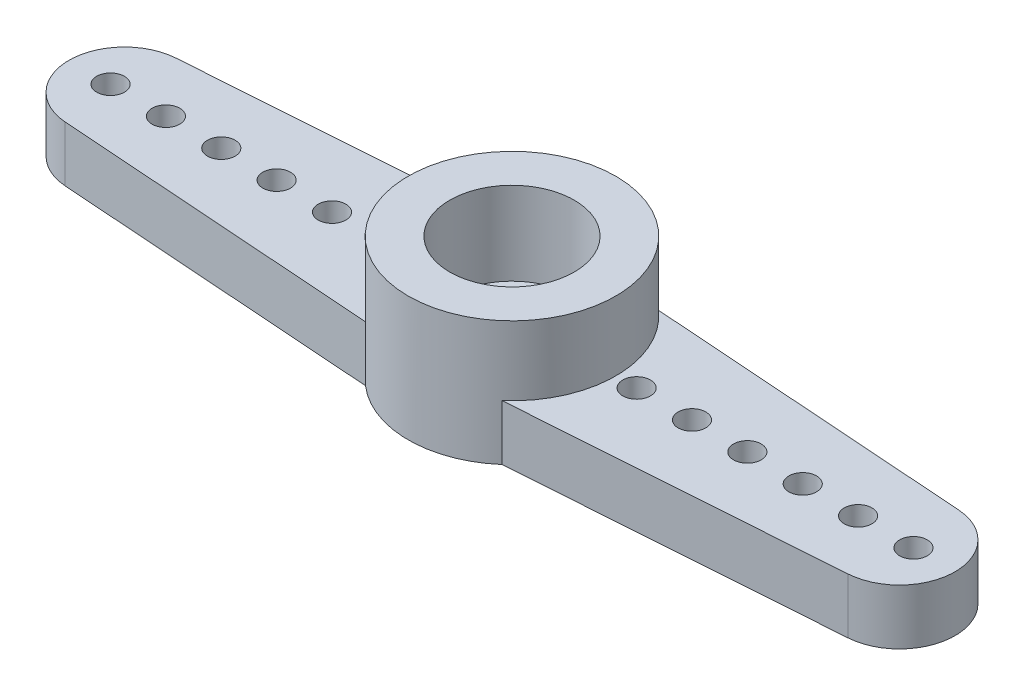
ISO-10303-21;
HEADER;
FILE_DESCRIPTION(('STEP AP214'),'2;1');
FILE_NAME('part.step','',(''),(''),'','','');
FILE_SCHEMA(('AUTOMOTIVE_DESIGN { 1 0 10303 214 1 1 1 1 }'));
ENDSEC;
DATA;
#1=APPLICATION_CONTEXT('core data for automotive mechanical design processes');
#2=APPLICATION_PROTOCOL_DEFINITION('international standard','automotive_design',2000,#1);
#3=PRODUCT_CONTEXT('',#1,'mechanical');
#4=PRODUCT('Part','Part','',(#3));
#5=PRODUCT_RELATED_PRODUCT_CATEGORY('part','',(#4));
#6=PRODUCT_DEFINITION_FORMATION('','',#4);
#7=PRODUCT_DEFINITION_CONTEXT('part definition',#1,'design');
#8=PRODUCT_DEFINITION('design','',#6,#7);
#9=PRODUCT_DEFINITION_SHAPE('','',#8);
#10=(LENGTH_UNIT() NAMED_UNIT(*) SI_UNIT(.MILLI.,.METRE.));
#11=(NAMED_UNIT(*) PLANE_ANGLE_UNIT() SI_UNIT($,.RADIAN.));
#12=(NAMED_UNIT(*) SI_UNIT($,.STERADIAN.) SOLID_ANGLE_UNIT());
#13=UNCERTAINTY_MEASURE_WITH_UNIT(LENGTH_MEASURE(1.E-05),#10,'distance_accuracy_value','');
#14=(GEOMETRIC_REPRESENTATION_CONTEXT(3) GLOBAL_UNCERTAINTY_ASSIGNED_CONTEXT((#13)) GLOBAL_UNIT_ASSIGNED_CONTEXT((#10,
#11,#12)) REPRESENTATION_CONTEXT('',''));
#15=CARTESIAN_POINT('',(0.,0.,0.));
#16=DIRECTION('',(0.,0.,1.));
#17=DIRECTION('',(1.,0.,0.));
#18=AXIS2_PLACEMENT_3D('',#15,#16,#17);
#19=CARTESIAN_POINT('',(0.,2.,-3.));
#20=DIRECTION('',(-0.070562639205869,0.,0.997507350322945));
#21=DIRECTION('',(0.997507350322945,0.,0.0705626392058691));
#22=AXIS2_PLACEMENT_3D('',#19,#20,#21);
#23=PLANE('',#22);
#24=DIRECTION('',(0.,-1.,0.));
#25=VECTOR('',#24,1.);
#26=CARTESIAN_POINT('',(2.46546325686744,4.5,-2.82559567685056));
#27=LINE('',#26,#25);
#28=CARTESIAN_POINT('',(2.46546325686744,2.,-2.82559567685056));
#29=VERTEX_POINT('',#28);
#30=CARTESIAN_POINT('',(2.46546325686744,0.,-2.82559567685056));
#31=VERTEX_POINT('',#30);
#32=EDGE_CURVE('E48',#29,#31,#27,.T.);
#33=ORIENTED_EDGE('',*,*,#32,.F.);
#34=DIRECTION('',(-0.997507350322945,0.,-0.0705626392058691));
#35=VECTOR('',#34,1.);
#36=CARTESIAN_POINT('',(0.,2.,-3.));
#37=LINE('',#36,#35);
#38=CARTESIAN_POINT('',(14.1364801763251,2.,-2.));
#39=VERTEX_POINT('',#38);
#40=EDGE_CURVE('E181',#39,#29,#37,.T.);
#41=ORIENTED_EDGE('',*,*,#40,.F.);
#42=DIRECTION('',(0.,-1.,0.));
#43=VECTOR('',#42,1.);
#44=CARTESIAN_POINT('',(14.1364801763251,2.,-2.));
#45=LINE('',#44,#43);
#46=CARTESIAN_POINT('',(14.1364801763251,0.,-2.));
#47=VERTEX_POINT('',#46);
#48=EDGE_CURVE('E41',#39,#47,#45,.T.);
#49=ORIENTED_EDGE('',*,*,#48,.T.);
#50=DIRECTION('',(-0.997507350322945,0.,-0.0705626392058691));
#51=VECTOR('',#50,1.);
#52=CARTESIAN_POINT('',(0.,0.,-3.));
#53=LINE('',#52,#51);
#54=EDGE_CURVE('E53',#47,#31,#53,.T.);
#55=ORIENTED_EDGE('',*,*,#54,.T.);
#56=EDGE_LOOP('',(#33,#41,#49,#55));
#57=FACE_BOUND('',#56,.T.);
#58=ADVANCED_FACE('F33',(#57),#23,.F.);
#59=CARTESIAN_POINT('',(13.9950022429885,2.,0.));
#60=DIRECTION('',(0.,-1.,0.));
#61=DIRECTION('',(0.,0.,-1.));
#62=AXIS2_PLACEMENT_3D('',#59,#60,#61);
#63=PLANE('',#62);
#64=CARTESIAN_POINT('',(0.,2.,0.));
#65=DIRECTION('',(0.,-1.,0.));
#66=DIRECTION('',(0.,0.,-1.));
#67=AXIS2_PLACEMENT_3D('',#64,#65,#66);
#68=CIRCLE('',#67,3.75);
#69=CARTESIAN_POINT('',(-2.46546325686744,2.,-2.82559567685056));
#70=VERTEX_POINT('',#69);
#71=CARTESIAN_POINT('',(-2.46546325686744,2.,2.82559567685056));
#72=VERTEX_POINT('',#71);
#73=EDGE_CURVE('E199',#70,#72,#68,.F.);
#74=ORIENTED_EDGE('',*,*,#73,.F.);
#75=DIRECTION('',(0.997507350322945,0.,-0.0705626392058691));
#76=VECTOR('',#75,1.);
#77=CARTESIAN_POINT('',(0.,2.,-3.));
#78=LINE('',#77,#76);
#79=CARTESIAN_POINT('',(-14.1364801763251,2.,-2.));
#80=VERTEX_POINT('',#79);
#81=EDGE_CURVE('E107',#80,#70,#78,.T.);
#82=ORIENTED_EDGE('',*,*,#81,.F.);
#83=CARTESIAN_POINT('',(-13.9950022429885,2.,0.));
#84=DIRECTION('',(0.,-1.,0.));
#85=DIRECTION('',(0.,0.,-1.));
#86=AXIS2_PLACEMENT_3D('',#83,#84,#85);
#87=CIRCLE('',#86,2.00499775701151);
#88=CARTESIAN_POINT('',(-14.1364801763251,2.,2.));
#89=VERTEX_POINT('',#88);
#90=EDGE_CURVE('E99',#89,#80,#87,.T.);
#91=ORIENTED_EDGE('',*,*,#90,.F.);
#92=DIRECTION('',(0.997507350322945,0.,0.0705626392058691));
#93=VECTOR('',#92,1.);
#94=CARTESIAN_POINT('',(0.,2.,3.));
#95=LINE('',#94,#93);
#96=EDGE_CURVE('E104',#89,#72,#95,.T.);
#97=ORIENTED_EDGE('',*,*,#96,.T.);
#98=EDGE_LOOP('',(#74,#82,#91,#97));
#99=FACE_BOUND('',#98,.T.);
#100=CARTESIAN_POINT('',(-4.5,2.,0.));
#101=DIRECTION('',(0.,-1.,0.));
#102=DIRECTION('',(0.,0.,-1.));
#103=AXIS2_PLACEMENT_3D('',#100,#101,#102);
#104=CIRCLE('',#103,0.500000000000001);
#105=CARTESIAN_POINT('',(-4.5,2.,-0.500000000000001));
#106=VERTEX_POINT('',#105);
#107=EDGE_CURVE('E123',#106,#106,#104,.T.);
#108=ORIENTED_EDGE('',*,*,#107,.T.);
#109=EDGE_LOOP('',(#108));
#110=FACE_BOUND('',#109,.T.);
#111=CARTESIAN_POINT('',(-6.5,2.,0.));
#112=DIRECTION('',(0.,-1.,0.));
#113=DIRECTION('',(0.,0.,-1.));
#114=AXIS2_PLACEMENT_3D('',#111,#112,#113);
#115=CIRCLE('',#114,0.500000000000001);
#116=CARTESIAN_POINT('',(-6.5,2.,-0.500000000000001));
#117=VERTEX_POINT('',#116);
#118=EDGE_CURVE('E239',#117,#117,#115,.T.);
#119=ORIENTED_EDGE('',*,*,#118,.T.);
#120=EDGE_LOOP('',(#119));
#121=FACE_BOUND('',#120,.T.);
#122=CARTESIAN_POINT('',(-8.5,2.,0.));
#123=DIRECTION('',(0.,-1.,0.));
#124=DIRECTION('',(0.,0.,-1.));
#125=AXIS2_PLACEMENT_3D('',#122,#123,#124);
#126=CIRCLE('',#125,0.500000000000001);
#127=CARTESIAN_POINT('',(-8.5,2.,-0.500000000000001));
#128=VERTEX_POINT('',#127);
#129=EDGE_CURVE('E233',#128,#128,#126,.T.);
#130=ORIENTED_EDGE('',*,*,#129,.T.);
#131=EDGE_LOOP('',(#130));
#132=FACE_BOUND('',#131,.T.);
#133=CARTESIAN_POINT('',(-10.5,2.,0.));
#134=DIRECTION('',(0.,-1.,0.));
#135=DIRECTION('',(0.,0.,-1.));
#136=AXIS2_PLACEMENT_3D('',#133,#134,#135);
#137=CIRCLE('',#136,0.500000000000001);
#138=CARTESIAN_POINT('',(-10.5,2.,-0.500000000000001));
#139=VERTEX_POINT('',#138);
#140=EDGE_CURVE('E227',#139,#139,#137,.T.);
#141=ORIENTED_EDGE('',*,*,#140,.T.);
#142=EDGE_LOOP('',(#141));
#143=FACE_BOUND('',#142,.T.);
#144=CARTESIAN_POINT('',(-12.5,2.,0.));
#145=DIRECTION('',(0.,-1.,0.));
#146=DIRECTION('',(0.,0.,-1.));
#147=AXIS2_PLACEMENT_3D('',#144,#145,#146);
#148=CIRCLE('',#147,0.500000000000001);
#149=CARTESIAN_POINT('',(-12.5,2.,-0.500000000000001));
#150=VERTEX_POINT('',#149);
#151=EDGE_CURVE('E221',#150,#150,#148,.T.);
#152=ORIENTED_EDGE('',*,*,#151,.T.);
#153=EDGE_LOOP('',(#152));
#154=FACE_BOUND('',#153,.T.);
#155=CARTESIAN_POINT('',(-14.5,2.,0.));
#156=DIRECTION('',(0.,-1.,0.));
#157=DIRECTION('',(0.,0.,-1.));
#158=AXIS2_PLACEMENT_3D('',#155,#156,#157);
#159=CIRCLE('',#158,0.500000000000001);
#160=CARTESIAN_POINT('',(-14.5,2.,-0.500000000000001));
#161=VERTEX_POINT('',#160);
#162=EDGE_CURVE('E215',#161,#161,#159,.T.);
#163=ORIENTED_EDGE('',*,*,#162,.T.);
#164=EDGE_LOOP('',(#163));
#165=FACE_BOUND('',#164,.T.);
#166=ADVANCED_FACE('F101',(#99,#110,#121,#132,#143,#154,#165),#63,.F.);
#167=CARTESIAN_POINT('',(0.,2.,3.));
#168=DIRECTION('',(0.070562639205869,0.,0.997507350322945));
#169=DIRECTION('',(0.997507350322945,0.,-0.0705626392058691));
#170=AXIS2_PLACEMENT_3D('',#167,#168,#169);
#171=PLANE('',#170);
#172=DIRECTION('',(-0.997507350322945,0.,0.0705626392058691));
#173=VECTOR('',#172,1.);
#174=CARTESIAN_POINT('',(0.,2.,3.));
#175=LINE('',#174,#173);
#176=CARTESIAN_POINT('',(14.1364801763251,2.,2.));
#177=VERTEX_POINT('',#176);
#178=CARTESIAN_POINT('',(2.46546325686744,2.,2.82559567685056));
#179=VERTEX_POINT('',#178);
#180=EDGE_CURVE('E170',#177,#179,#175,.T.);
#181=ORIENTED_EDGE('',*,*,#180,.T.);
#182=DIRECTION('',(0.,-1.,0.));
#183=VECTOR('',#182,1.);
#184=CARTESIAN_POINT('',(2.46546325686744,4.5,2.82559567685056));
#185=LINE('',#184,#183);
#186=CARTESIAN_POINT('',(2.46546325686744,0.,2.82559567685056));
#187=VERTEX_POINT('',#186);
#188=EDGE_CURVE('E209',#179,#187,#185,.T.);
#189=ORIENTED_EDGE('',*,*,#188,.T.);
#190=DIRECTION('',(-0.997507350322945,0.,0.0705626392058691));
#191=VECTOR('',#190,1.);
#192=CARTESIAN_POINT('',(0.,0.,3.));
#193=LINE('',#192,#191);
#194=CARTESIAN_POINT('',(14.1364801763251,0.,2.));
#195=VERTEX_POINT('',#194);
#196=EDGE_CURVE('E169',#195,#187,#193,.T.);
#197=ORIENTED_EDGE('',*,*,#196,.F.);
#198=DIRECTION('',(0.,-1.,0.));
#199=VECTOR('',#198,1.);
#200=CARTESIAN_POINT('',(14.1364801763251,2.,2.));
#201=LINE('',#200,#199);
#202=EDGE_CURVE('E173',#177,#195,#201,.T.);
#203=ORIENTED_EDGE('',*,*,#202,.F.);
#204=EDGE_LOOP('',(#181,#189,#197,#203));
#205=FACE_BOUND('',#204,.T.);
#206=ADVANCED_FACE('F267',(#205),#171,.T.);
#207=CARTESIAN_POINT('',(0.,2.,-3.));
#208=DIRECTION('',(-0.070562639205869,0.,-0.997507350322945));
#209=DIRECTION('',(-0.997507350322945,0.,0.0705626392058691));
#210=AXIS2_PLACEMENT_3D('',#207,#208,#209);
#211=PLANE('',#210);
#212=ORIENTED_EDGE('',*,*,#81,.T.);
#213=DIRECTION('',(0.,-1.,0.));
#214=VECTOR('',#213,1.);
#215=CARTESIAN_POINT('',(-2.46546325686744,4.5,-2.82559567685056));
#216=LINE('',#215,#214);
#217=CARTESIAN_POINT('',(-2.46546325686744,0.,-2.82559567685056));
#218=VERTEX_POINT('',#217);
#219=EDGE_CURVE('E206',#70,#218,#216,.T.);
#220=ORIENTED_EDGE('',*,*,#219,.T.);
#221=DIRECTION('',(0.997507350322945,0.,-0.0705626392058691));
#222=VECTOR('',#221,1.);
#223=CARTESIAN_POINT('',(0.,0.,-3.));
#224=LINE('',#223,#222);
#225=CARTESIAN_POINT('',(-14.1364801763251,0.,-2.));
#226=VERTEX_POINT('',#225);
#227=EDGE_CURVE('E118',#226,#218,#224,.T.);
#228=ORIENTED_EDGE('',*,*,#227,.F.);
#229=DIRECTION('',(0.,-1.,0.));
#230=VECTOR('',#229,1.);
#231=CARTESIAN_POINT('',(-14.1364801763251,2.,-2.));
#232=LINE('',#231,#230);
#233=EDGE_CURVE('E109',#80,#226,#232,.T.);
#234=ORIENTED_EDGE('',*,*,#233,.F.);
#235=EDGE_LOOP('',(#212,#220,#228,#234));
#236=FACE_BOUND('',#235,.T.);
#237=ADVANCED_FACE('F279',(#236),#211,.T.);
#238=CARTESIAN_POINT('',(0.,2.,3.));
#239=DIRECTION('',(0.070562639205869,0.,-0.997507350322945));
#240=DIRECTION('',(-0.997507350322945,0.,-0.0705626392058691));
#241=AXIS2_PLACEMENT_3D('',#238,#239,#240);
#242=PLANE('',#241);
#243=DIRECTION('',(0.,-1.,0.));
#244=VECTOR('',#243,1.);
#245=CARTESIAN_POINT('',(-2.46546325686744,4.5,2.82559567685056));
#246=LINE('',#245,#244);
#247=CARTESIAN_POINT('',(-2.46546325686744,0.,2.82559567685056));
#248=VERTEX_POINT('',#247);
#249=EDGE_CURVE('E11',#72,#248,#246,.T.);
#250=ORIENTED_EDGE('',*,*,#249,.F.);
#251=ORIENTED_EDGE('',*,*,#96,.F.);
#252=DIRECTION('',(0.,-1.,0.));
#253=VECTOR('',#252,1.);
#254=CARTESIAN_POINT('',(-14.1364801763251,2.,2.));
#255=LINE('',#254,#253);
#256=CARTESIAN_POINT('',(-14.1364801763251,0.,2.));
#257=VERTEX_POINT('',#256);
#258=EDGE_CURVE('E112',#89,#257,#255,.T.);
#259=ORIENTED_EDGE('',*,*,#258,.T.);
#260=DIRECTION('',(0.997507350322945,0.,0.0705626392058691));
#261=VECTOR('',#260,1.);
#262=CARTESIAN_POINT('',(0.,0.,3.));
#263=LINE('',#262,#261);
#264=EDGE_CURVE('E121',#257,#248,#263,.T.);
#265=ORIENTED_EDGE('',*,*,#264,.T.);
#266=EDGE_LOOP('',(#250,#251,#259,#265));
#267=FACE_BOUND('',#266,.T.);
#268=ADVANCED_FACE('F120',(#267),#242,.F.);
#269=CARTESIAN_POINT('',(13.9950022429885,2.,0.));
#270=DIRECTION('',(0.,-1.,0.));
#271=DIRECTION('',(0.,0.,-1.));
#272=AXIS2_PLACEMENT_3D('',#269,#270,#271);
#273=CYLINDRICAL_SURFACE('',#272,2.00499775701151);
#274=CARTESIAN_POINT('',(13.9950022429885,0.,0.));
#275=DIRECTION('',(0.,1.,0.));
#276=DIRECTION('',(0.,0.,-1.));
#277=AXIS2_PLACEMENT_3D('',#274,#275,#276);
#278=CIRCLE('',#277,2.00499775701151);
#279=EDGE_CURVE('E178',#195,#47,#278,.T.);
#280=ORIENTED_EDGE('',*,*,#279,.T.);
#281=ORIENTED_EDGE('',*,*,#48,.F.);
#282=CARTESIAN_POINT('',(13.9950022429885,2.,0.));
#283=DIRECTION('',(0.,1.,0.));
#284=DIRECTION('',(0.,0.,-1.));
#285=AXIS2_PLACEMENT_3D('',#282,#283,#284);
#286=CIRCLE('',#285,2.00499775701151);
#287=EDGE_CURVE('E179',#177,#39,#286,.T.);
#288=ORIENTED_EDGE('',*,*,#287,.F.);
#289=ORIENTED_EDGE('',*,*,#202,.T.);
#290=EDGE_LOOP('',(#280,#281,#288,#289));
#291=FACE_BOUND('',#290,.T.);
#292=ADVANCED_FACE('F35',(#291),#273,.T.);
#293=EDGE_CURVE('E207',#179,#29,#68,.F.);
#294=ORIENTED_EDGE('',*,*,#293,.F.);
#295=ORIENTED_EDGE('',*,*,#180,.F.);
#296=ORIENTED_EDGE('',*,*,#287,.T.);
#297=ORIENTED_EDGE('',*,*,#40,.T.);
#298=EDGE_LOOP('',(#294,#295,#296,#297));
#299=FACE_BOUND('',#298,.T.);
#300=CARTESIAN_POINT('',(14.5,2.,0.));
#301=DIRECTION('',(0.,-1.,0.));
#302=DIRECTION('',(0.,0.,-1.));
#303=AXIS2_PLACEMENT_3D('',#300,#301,#302);
#304=CIRCLE('',#303,0.500000000000001);
#305=CARTESIAN_POINT('',(14.5,2.,-0.500000000000001));
#306=VERTEX_POINT('',#305);
#307=EDGE_CURVE('E136',#306,#306,#304,.F.);
#308=ORIENTED_EDGE('',*,*,#307,.F.);
#309=EDGE_LOOP('',(#308));
#310=FACE_BOUND('',#309,.T.);
#311=CARTESIAN_POINT('',(12.5,2.,0.));
#312=DIRECTION('',(0.,-1.,0.));
#313=DIRECTION('',(0.,0.,-1.));
#314=AXIS2_PLACEMENT_3D('',#311,#312,#313);
#315=CIRCLE('',#314,0.500000000000001);
#316=CARTESIAN_POINT('',(12.5,2.,-0.500000000000001));
#317=VERTEX_POINT('',#316);
#318=EDGE_CURVE('E142',#317,#317,#315,.F.);
#319=ORIENTED_EDGE('',*,*,#318,.F.);
#320=EDGE_LOOP('',(#319));
#321=FACE_BOUND('',#320,.T.);
#322=CARTESIAN_POINT('',(10.5,2.,0.));
#323=DIRECTION('',(0.,-1.,0.));
#324=DIRECTION('',(0.,0.,-1.));
#325=AXIS2_PLACEMENT_3D('',#322,#323,#324);
#326=CIRCLE('',#325,0.500000000000001);
#327=CARTESIAN_POINT('',(10.5,2.,-0.500000000000001));
#328=VERTEX_POINT('',#327);
#329=EDGE_CURVE('E148',#328,#328,#326,.F.);
#330=ORIENTED_EDGE('',*,*,#329,.F.);
#331=EDGE_LOOP('',(#330));
#332=FACE_BOUND('',#331,.T.);
#333=CARTESIAN_POINT('',(8.5,2.,0.));
#334=DIRECTION('',(0.,-1.,0.));
#335=DIRECTION('',(0.,0.,-1.));
#336=AXIS2_PLACEMENT_3D('',#333,#334,#335);
#337=CIRCLE('',#336,0.500000000000001);
#338=CARTESIAN_POINT('',(8.5,2.,-0.500000000000001));
#339=VERTEX_POINT('',#338);
#340=EDGE_CURVE('E154',#339,#339,#337,.F.);
#341=ORIENTED_EDGE('',*,*,#340,.F.);
#342=EDGE_LOOP('',(#341));
#343=FACE_BOUND('',#342,.T.);
#344=CARTESIAN_POINT('',(6.5,2.,0.));
#345=DIRECTION('',(0.,-1.,0.));
#346=DIRECTION('',(0.,0.,-1.));
#347=AXIS2_PLACEMENT_3D('',#344,#345,#346);
#348=CIRCLE('',#347,0.500000000000001);
#349=CARTESIAN_POINT('',(6.5,2.,-0.500000000000001));
#350=VERTEX_POINT('',#349);
#351=EDGE_CURVE('E160',#350,#350,#348,.F.);
#352=ORIENTED_EDGE('',*,*,#351,.F.);
#353=EDGE_LOOP('',(#352));
#354=FACE_BOUND('',#353,.T.);
#355=CARTESIAN_POINT('',(4.5,2.,0.));
#356=DIRECTION('',(0.,-1.,0.));
#357=DIRECTION('',(0.,0.,-1.));
#358=AXIS2_PLACEMENT_3D('',#355,#356,#357);
#359=CIRCLE('',#358,0.500000000000001);
#360=CARTESIAN_POINT('',(4.5,2.,-0.500000000000001));
#361=VERTEX_POINT('',#360);
#362=EDGE_CURVE('E166',#361,#361,#359,.F.);
#363=ORIENTED_EDGE('',*,*,#362,.F.);
#364=EDGE_LOOP('',(#363));
#365=FACE_BOUND('',#364,.T.);
#366=ADVANCED_FACE('F269',(#299,#310,#321,#332,#343,#354,#365),#63,.F.);
#367=CARTESIAN_POINT('',(13.9950022429885,0.,0.));
#368=DIRECTION('',(0.,-1.,0.));
#369=DIRECTION('',(0.,0.,-1.));
#370=AXIS2_PLACEMENT_3D('',#367,#368,#369);
#371=PLANE('',#370);
#372=CARTESIAN_POINT('',(0.,0.,0.));
#373=DIRECTION('',(0.,-1.,0.));
#374=DIRECTION('',(0.,0.,-1.));
#375=AXIS2_PLACEMENT_3D('',#372,#373,#374);
#376=CIRCLE('',#375,1.4);
#377=CARTESIAN_POINT('',(0.,0.,-1.4));
#378=VERTEX_POINT('',#377);
#379=EDGE_CURVE('E487',#378,#378,#376,.T.);
#380=ORIENTED_EDGE('',*,*,#379,.F.);
#381=EDGE_LOOP('',(#380));
#382=FACE_BOUND('',#381,.T.);
#383=ORIENTED_EDGE('',*,*,#196,.T.);
#384=CARTESIAN_POINT('',(0.,0.,0.));
#385=DIRECTION('',(0.,1.,0.));
#386=DIRECTION('',(0.,0.,1.));
#387=AXIS2_PLACEMENT_3D('',#384,#385,#386);
#388=CIRCLE('',#387,3.75);
#389=EDGE_CURVE('E196',#248,#187,#388,.T.);
#390=ORIENTED_EDGE('',*,*,#389,.F.);
#391=ORIENTED_EDGE('',*,*,#264,.F.);
#392=CARTESIAN_POINT('',(-13.9950022429885,0.,0.));
#393=DIRECTION('',(0.,-1.,0.));
#394=DIRECTION('',(0.,0.,-1.));
#395=AXIS2_PLACEMENT_3D('',#392,#393,#394);
#396=CIRCLE('',#395,2.00499775701151);
#397=EDGE_CURVE('E115',#257,#226,#396,.T.);
#398=ORIENTED_EDGE('',*,*,#397,.T.);
#399=ORIENTED_EDGE('',*,*,#227,.T.);
#400=EDGE_CURVE('E191',#31,#218,#388,.T.);
#401=ORIENTED_EDGE('',*,*,#400,.F.);
#402=ORIENTED_EDGE('',*,*,#54,.F.);
#403=ORIENTED_EDGE('',*,*,#279,.F.);
#404=EDGE_LOOP('',(#383,#390,#391,#398,#399,#401,#402,#403));
#405=FACE_BOUND('',#404,.T.);
#406=CARTESIAN_POINT('',(14.5,0.,0.));
#407=DIRECTION('',(0.,1.,0.));
#408=DIRECTION('',(0.,0.,1.));
#409=AXIS2_PLACEMENT_3D('',#406,#407,#408);
#410=CIRCLE('',#409,0.500000000000001);
#411=CARTESIAN_POINT('',(14.5,0.,0.500000000000001));
#412=VERTEX_POINT('',#411);
#413=EDGE_CURVE('E133',#412,#412,#410,.T.);
#414=ORIENTED_EDGE('',*,*,#413,.T.);
#415=EDGE_LOOP('',(#414));
#416=FACE_BOUND('',#415,.T.);
#417=CARTESIAN_POINT('',(12.5,0.,0.));
#418=DIRECTION('',(0.,1.,0.));
#419=DIRECTION('',(0.,0.,1.));
#420=AXIS2_PLACEMENT_3D('',#417,#418,#419);
#421=CIRCLE('',#420,0.500000000000001);
#422=CARTESIAN_POINT('',(12.5,0.,0.500000000000001));
#423=VERTEX_POINT('',#422);
#424=EDGE_CURVE('E139',#423,#423,#421,.T.);
#425=ORIENTED_EDGE('',*,*,#424,.T.);
#426=EDGE_LOOP('',(#425));
#427=FACE_BOUND('',#426,.T.);
#428=CARTESIAN_POINT('',(10.5,0.,0.));
#429=DIRECTION('',(0.,1.,0.));
#430=DIRECTION('',(0.,0.,1.));
#431=AXIS2_PLACEMENT_3D('',#428,#429,#430);
#432=CIRCLE('',#431,0.500000000000001);
#433=CARTESIAN_POINT('',(10.5,0.,0.500000000000001));
#434=VERTEX_POINT('',#433);
#435=EDGE_CURVE('E145',#434,#434,#432,.T.);
#436=ORIENTED_EDGE('',*,*,#435,.T.);
#437=EDGE_LOOP('',(#436));
#438=FACE_BOUND('',#437,.T.);
#439=CARTESIAN_POINT('',(8.5,0.,0.));
#440=DIRECTION('',(0.,1.,0.));
#441=DIRECTION('',(0.,0.,1.));
#442=AXIS2_PLACEMENT_3D('',#439,#440,#441);
#443=CIRCLE('',#442,0.500000000000001);
#444=CARTESIAN_POINT('',(8.5,0.,0.500000000000001));
#445=VERTEX_POINT('',#444);
#446=EDGE_CURVE('E151',#445,#445,#443,.T.);
#447=ORIENTED_EDGE('',*,*,#446,.T.);
#448=EDGE_LOOP('',(#447));
#449=FACE_BOUND('',#448,.T.);
#450=CARTESIAN_POINT('',(6.5,0.,0.));
#451=DIRECTION('',(0.,1.,0.));
#452=DIRECTION('',(0.,0.,1.));
#453=AXIS2_PLACEMENT_3D('',#450,#451,#452);
#454=CIRCLE('',#453,0.500000000000001);
#455=CARTESIAN_POINT('',(6.5,0.,0.500000000000001));
#456=VERTEX_POINT('',#455);
#457=EDGE_CURVE('E157',#456,#456,#454,.T.);
#458=ORIENTED_EDGE('',*,*,#457,.T.);
#459=EDGE_LOOP('',(#458));
#460=FACE_BOUND('',#459,.T.);
#461=CARTESIAN_POINT('',(4.5,0.,0.));
#462=DIRECTION('',(0.,1.,0.));
#463=DIRECTION('',(0.,0.,1.));
#464=AXIS2_PLACEMENT_3D('',#461,#462,#463);
#465=CIRCLE('',#464,0.500000000000001);
#466=CARTESIAN_POINT('',(4.5,0.,0.500000000000001));
#467=VERTEX_POINT('',#466);
#468=EDGE_CURVE('E163',#467,#467,#465,.T.);
#469=ORIENTED_EDGE('',*,*,#468,.T.);
#470=EDGE_LOOP('',(#469));
#471=FACE_BOUND('',#470,.T.);
#472=CARTESIAN_POINT('',(-4.5,0.,0.));
#473=DIRECTION('',(0.,-1.,0.));
#474=DIRECTION('',(0.,0.,1.));
#475=AXIS2_PLACEMENT_3D('',#472,#473,#474);
#476=CIRCLE('',#475,0.500000000000001);
#477=CARTESIAN_POINT('',(-4.5,0.,0.500000000000001));
#478=VERTEX_POINT('',#477);
#479=EDGE_CURVE('E241',#478,#478,#476,.T.);
#480=ORIENTED_EDGE('',*,*,#479,.F.);
#481=EDGE_LOOP('',(#480));
#482=FACE_BOUND('',#481,.T.);
#483=CARTESIAN_POINT('',(-6.5,0.,0.));
#484=DIRECTION('',(0.,-1.,0.));
#485=DIRECTION('',(0.,0.,1.));
#486=AXIS2_PLACEMENT_3D('',#483,#484,#485);
#487=CIRCLE('',#486,0.500000000000001);
#488=CARTESIAN_POINT('',(-6.5,0.,0.500000000000001));
#489=VERTEX_POINT('',#488);
#490=EDGE_CURVE('E236',#489,#489,#487,.T.);
#491=ORIENTED_EDGE('',*,*,#490,.F.);
#492=EDGE_LOOP('',(#491));
#493=FACE_BOUND('',#492,.T.);
#494=CARTESIAN_POINT('',(-8.5,0.,0.));
#495=DIRECTION('',(0.,-1.,0.));
#496=DIRECTION('',(0.,0.,1.));
#497=AXIS2_PLACEMENT_3D('',#494,#495,#496);
#498=CIRCLE('',#497,0.500000000000001);
#499=CARTESIAN_POINT('',(-8.5,0.,0.500000000000001));
#500=VERTEX_POINT('',#499);
#501=EDGE_CURVE('E230',#500,#500,#498,.T.);
#502=ORIENTED_EDGE('',*,*,#501,.F.);
#503=EDGE_LOOP('',(#502));
#504=FACE_BOUND('',#503,.T.);
#505=CARTESIAN_POINT('',(-10.5,0.,0.));
#506=DIRECTION('',(0.,-1.,0.));
#507=DIRECTION('',(0.,0.,1.));
#508=AXIS2_PLACEMENT_3D('',#505,#506,#507);
#509=CIRCLE('',#508,0.500000000000001);
#510=CARTESIAN_POINT('',(-10.5,0.,0.500000000000001));
#511=VERTEX_POINT('',#510);
#512=EDGE_CURVE('E224',#511,#511,#509,.T.);
#513=ORIENTED_EDGE('',*,*,#512,.F.);
#514=EDGE_LOOP('',(#513));
#515=FACE_BOUND('',#514,.T.);
#516=CARTESIAN_POINT('',(-12.5,0.,0.));
#517=DIRECTION('',(0.,-1.,0.));
#518=DIRECTION('',(0.,0.,1.));
#519=AXIS2_PLACEMENT_3D('',#516,#517,#518);
#520=CIRCLE('',#519,0.500000000000001);
#521=CARTESIAN_POINT('',(-12.5,0.,0.500000000000001));
#522=VERTEX_POINT('',#521);
#523=EDGE_CURVE('E218',#522,#522,#520,.T.);
#524=ORIENTED_EDGE('',*,*,#523,.F.);
#525=EDGE_LOOP('',(#524));
#526=FACE_BOUND('',#525,.T.);
#527=CARTESIAN_POINT('',(-14.5,0.,0.));
#528=DIRECTION('',(0.,-1.,0.));
#529=DIRECTION('',(0.,0.,1.));
#530=AXIS2_PLACEMENT_3D('',#527,#528,#529);
#531=CIRCLE('',#530,0.500000000000001);
#532=CARTESIAN_POINT('',(-14.5,0.,0.500000000000001));
#533=VERTEX_POINT('',#532);
#534=EDGE_CURVE('E212',#533,#533,#531,.T.);
#535=ORIENTED_EDGE('',*,*,#534,.F.);
#536=EDGE_LOOP('',(#535));
#537=FACE_BOUND('',#536,.T.);
#538=ADVANCED_FACE('F188',(#382,#405,#416,#427,#438,#449,#460,#471,#482,#493,#504,#515,#526,
#537),#371,.T.);
#539=CARTESIAN_POINT('',(4.5,3.,0.));
#540=DIRECTION('',(0.,-1.,0.));
#541=DIRECTION('',(0.,0.,-1.));
#542=AXIS2_PLACEMENT_3D('',#539,#540,#541);
#543=CYLINDRICAL_SURFACE('',#542,0.500000000000001);
#544=ORIENTED_EDGE('',*,*,#468,.F.);
#545=EDGE_LOOP('',(#544));
#546=FACE_BOUND('',#545,.T.);
#547=ORIENTED_EDGE('',*,*,#362,.T.);
#548=EDGE_LOOP('',(#547));
#549=FACE_BOUND('',#548,.T.);
#550=ADVANCED_FACE('F272',(#546,#549),#543,.F.);
#551=CARTESIAN_POINT('',(6.5,3.,0.));
#552=DIRECTION('',(0.,-1.,0.));
#553=DIRECTION('',(0.,0.,-1.));
#554=AXIS2_PLACEMENT_3D('',#551,#552,#553);
#555=CYLINDRICAL_SURFACE('',#554,0.500000000000001);
#556=ORIENTED_EDGE('',*,*,#457,.F.);
#557=EDGE_LOOP('',(#556));
#558=FACE_BOUND('',#557,.T.);
#559=ORIENTED_EDGE('',*,*,#351,.T.);
#560=EDGE_LOOP('',(#559));
#561=FACE_BOUND('',#560,.T.);
#562=ADVANCED_FACE('F283',(#558,#561),#555,.F.);
#563=CARTESIAN_POINT('',(8.5,3.,0.));
#564=DIRECTION('',(0.,-1.,0.));
#565=DIRECTION('',(0.,0.,-1.));
#566=AXIS2_PLACEMENT_3D('',#563,#564,#565);
#567=CYLINDRICAL_SURFACE('',#566,0.500000000000001);
#568=ORIENTED_EDGE('',*,*,#446,.F.);
#569=EDGE_LOOP('',(#568));
#570=FACE_BOUND('',#569,.T.);
#571=ORIENTED_EDGE('',*,*,#340,.T.);
#572=EDGE_LOOP('',(#571));
#573=FACE_BOUND('',#572,.T.);
#574=ADVANCED_FACE('F287',(#570,#573),#567,.F.);
#575=CARTESIAN_POINT('',(10.5,3.,0.));
#576=DIRECTION('',(0.,-1.,0.));
#577=DIRECTION('',(0.,0.,-1.));
#578=AXIS2_PLACEMENT_3D('',#575,#576,#577);
#579=CYLINDRICAL_SURFACE('',#578,0.500000000000001);
#580=ORIENTED_EDGE('',*,*,#435,.F.);
#581=EDGE_LOOP('',(#580));
#582=FACE_BOUND('',#581,.T.);
#583=ORIENTED_EDGE('',*,*,#329,.T.);
#584=EDGE_LOOP('',(#583));
#585=FACE_BOUND('',#584,.T.);
#586=ADVANCED_FACE('F291',(#582,#585),#579,.F.);
#587=CARTESIAN_POINT('',(12.5,3.,0.));
#588=DIRECTION('',(0.,-1.,0.));
#589=DIRECTION('',(0.,0.,-1.));
#590=AXIS2_PLACEMENT_3D('',#587,#588,#589);
#591=CYLINDRICAL_SURFACE('',#590,0.500000000000001);
#592=ORIENTED_EDGE('',*,*,#424,.F.);
#593=EDGE_LOOP('',(#592));
#594=FACE_BOUND('',#593,.T.);
#595=ORIENTED_EDGE('',*,*,#318,.T.);
#596=EDGE_LOOP('',(#595));
#597=FACE_BOUND('',#596,.T.);
#598=ADVANCED_FACE('F295',(#594,#597),#591,.F.);
#599=CARTESIAN_POINT('',(14.5,3.,0.));
#600=DIRECTION('',(0.,-1.,0.));
#601=DIRECTION('',(0.,0.,-1.));
#602=AXIS2_PLACEMENT_3D('',#599,#600,#601);
#603=CYLINDRICAL_SURFACE('',#602,0.500000000000001);
#604=ORIENTED_EDGE('',*,*,#413,.F.);
#605=EDGE_LOOP('',(#604));
#606=FACE_BOUND('',#605,.T.);
#607=ORIENTED_EDGE('',*,*,#307,.T.);
#608=EDGE_LOOP('',(#607));
#609=FACE_BOUND('',#608,.T.);
#610=ADVANCED_FACE('F260',(#606,#609),#603,.F.);
#611=CARTESIAN_POINT('',(-13.9950022429885,2.,0.));
#612=DIRECTION('',(0.,-1.,0.));
#613=DIRECTION('',(0.,0.,-1.));
#614=AXIS2_PLACEMENT_3D('',#611,#612,#613);
#615=CYLINDRICAL_SURFACE('',#614,2.00499775701151);
#616=ORIENTED_EDGE('',*,*,#397,.F.);
#617=ORIENTED_EDGE('',*,*,#258,.F.);
#618=ORIENTED_EDGE('',*,*,#90,.T.);
#619=ORIENTED_EDGE('',*,*,#233,.T.);
#620=EDGE_LOOP('',(#616,#617,#618,#619));
#621=FACE_BOUND('',#620,.T.);
#622=ADVANCED_FACE('F113',(#621),#615,.T.);
#623=CARTESIAN_POINT('',(-4.5,3.,0.));
#624=DIRECTION('',(0.,-1.,0.));
#625=DIRECTION('',(0.,0.,-1.));
#626=AXIS2_PLACEMENT_3D('',#623,#624,#625);
#627=CYLINDRICAL_SURFACE('',#626,0.500000000000001);
#628=ORIENTED_EDGE('',*,*,#479,.T.);
#629=EDGE_LOOP('',(#628));
#630=FACE_BOUND('',#629,.T.);
#631=ORIENTED_EDGE('',*,*,#107,.F.);
#632=EDGE_LOOP('',(#631));
#633=FACE_BOUND('',#632,.T.);
#634=ADVANCED_FACE('F249',(#630,#633),#627,.F.);
#635=CARTESIAN_POINT('',(-6.5,3.,0.));
#636=DIRECTION('',(0.,-1.,0.));
#637=DIRECTION('',(0.,0.,-1.));
#638=AXIS2_PLACEMENT_3D('',#635,#636,#637);
#639=CYLINDRICAL_SURFACE('',#638,0.500000000000001);
#640=ORIENTED_EDGE('',*,*,#490,.T.);
#641=EDGE_LOOP('',(#640));
#642=FACE_BOUND('',#641,.T.);
#643=ORIENTED_EDGE('',*,*,#118,.F.);
#644=EDGE_LOOP('',(#643));
#645=FACE_BOUND('',#644,.T.);
#646=ADVANCED_FACE('F251',(#642,#645),#639,.F.);
#647=CARTESIAN_POINT('',(-8.5,3.,0.));
#648=DIRECTION('',(0.,-1.,0.));
#649=DIRECTION('',(0.,0.,-1.));
#650=AXIS2_PLACEMENT_3D('',#647,#648,#649);
#651=CYLINDRICAL_SURFACE('',#650,0.500000000000001);
#652=ORIENTED_EDGE('',*,*,#501,.T.);
#653=EDGE_LOOP('',(#652));
#654=FACE_BOUND('',#653,.T.);
#655=ORIENTED_EDGE('',*,*,#129,.F.);
#656=EDGE_LOOP('',(#655));
#657=FACE_BOUND('',#656,.T.);
#658=ADVANCED_FACE('F257',(#654,#657),#651,.F.);
#659=CARTESIAN_POINT('',(-10.5,3.,0.));
#660=DIRECTION('',(0.,-1.,0.));
#661=DIRECTION('',(0.,0.,-1.));
#662=AXIS2_PLACEMENT_3D('',#659,#660,#661);
#663=CYLINDRICAL_SURFACE('',#662,0.500000000000001);
#664=ORIENTED_EDGE('',*,*,#512,.T.);
#665=EDGE_LOOP('',(#664));
#666=FACE_BOUND('',#665,.T.);
#667=ORIENTED_EDGE('',*,*,#140,.F.);
#668=EDGE_LOOP('',(#667));
#669=FACE_BOUND('',#668,.T.);
#670=ADVANCED_FACE('F356',(#666,#669),#663,.F.);
#671=CARTESIAN_POINT('',(-12.5,3.,0.));
#672=DIRECTION('',(0.,-1.,0.));
#673=DIRECTION('',(0.,0.,-1.));
#674=AXIS2_PLACEMENT_3D('',#671,#672,#673);
#675=CYLINDRICAL_SURFACE('',#674,0.500000000000001);
#676=ORIENTED_EDGE('',*,*,#523,.T.);
#677=EDGE_LOOP('',(#676));
#678=FACE_BOUND('',#677,.T.);
#679=ORIENTED_EDGE('',*,*,#151,.F.);
#680=EDGE_LOOP('',(#679));
#681=FACE_BOUND('',#680,.T.);
#682=ADVANCED_FACE('F348',(#678,#681),#675,.F.);
#683=CARTESIAN_POINT('',(-14.5,3.,0.));
#684=DIRECTION('',(0.,-1.,0.));
#685=DIRECTION('',(0.,0.,-1.));
#686=AXIS2_PLACEMENT_3D('',#683,#684,#685);
#687=CYLINDRICAL_SURFACE('',#686,0.500000000000001);
#688=ORIENTED_EDGE('',*,*,#534,.T.);
#689=EDGE_LOOP('',(#688));
#690=FACE_BOUND('',#689,.T.);
#691=ORIENTED_EDGE('',*,*,#162,.F.);
#692=EDGE_LOOP('',(#691));
#693=FACE_BOUND('',#692,.T.);
#694=ADVANCED_FACE('F338',(#690,#693),#687,.F.);
#695=CARTESIAN_POINT('',(0.,4.5,0.));
#696=DIRECTION('',(0.,-1.,0.));
#697=DIRECTION('',(0.,0.,-1.));
#698=AXIS2_PLACEMENT_3D('',#695,#696,#697);
#699=CYLINDRICAL_SURFACE('',#698,3.75);
#700=CARTESIAN_POINT('',(0.,4.5,0.));
#701=DIRECTION('',(0.,1.,0.));
#702=DIRECTION('',(0.,0.,1.));
#703=AXIS2_PLACEMENT_3D('',#700,#701,#702);
#704=CIRCLE('',#703,3.75);
#705=CARTESIAN_POINT('',(0.,4.5,3.75));
#706=VERTEX_POINT('',#705);
#707=EDGE_CURVE('E195',#706,#706,#704,.T.);
#708=ORIENTED_EDGE('',*,*,#707,.F.);
#709=EDGE_LOOP('',(#708));
#710=FACE_BOUND('',#709,.T.);
#711=ORIENTED_EDGE('',*,*,#293,.T.);
#712=ORIENTED_EDGE('',*,*,#32,.T.);
#713=ORIENTED_EDGE('',*,*,#400,.T.);
#714=ORIENTED_EDGE('',*,*,#219,.F.);
#715=ORIENTED_EDGE('',*,*,#73,.T.);
#716=ORIENTED_EDGE('',*,*,#249,.T.);
#717=ORIENTED_EDGE('',*,*,#389,.T.);
#718=ORIENTED_EDGE('',*,*,#188,.F.);
#719=EDGE_LOOP('',(#711,#712,#713,#714,#715,#716,#717,#718));
#720=FACE_BOUND('',#719,.T.);
#721=ADVANCED_FACE('F317',(#710,#720),#699,.T.);
#722=CARTESIAN_POINT('',(0.,4.5,0.));
#723=DIRECTION('',(0.,1.,0.));
#724=DIRECTION('',(0.,0.,1.));
#725=AXIS2_PLACEMENT_3D('',#722,#723,#724);
#726=PLANE('',#725);
#727=CARTESIAN_POINT('',(0.,4.5,0.));
#728=DIRECTION('',(0.,1.,0.));
#729=DIRECTION('',(0.,0.,1.));
#730=AXIS2_PLACEMENT_3D('',#727,#728,#729);
#731=CIRCLE('',#730,2.25);
#732=CARTESIAN_POINT('',(0.,4.5,2.25));
#733=VERTEX_POINT('',#732);
#734=EDGE_CURVE('E492',#733,#733,#731,.T.);
#735=ORIENTED_EDGE('',*,*,#734,.F.);
#736=EDGE_LOOP('',(#735));
#737=FACE_BOUND('',#736,.T.);
#738=ORIENTED_EDGE('',*,*,#707,.T.);
#739=EDGE_LOOP('',(#738));
#740=FACE_BOUND('',#739,.T.);
#741=ADVANCED_FACE('F337',(#737,#740),#726,.T.);
#742=CARTESIAN_POINT('',(0.,1.5,0.));
#743=DIRECTION('',(0.,1.,0.));
#744=DIRECTION('',(0.,0.,1.));
#745=AXIS2_PLACEMENT_3D('',#742,#743,#744);
#746=CYLINDRICAL_SURFACE('',#745,2.25);
#747=CARTESIAN_POINT('',(0.,1.5,0.));
#748=DIRECTION('',(0.,1.,0.));
#749=DIRECTION('',(0.,0.,1.));
#750=AXIS2_PLACEMENT_3D('',#747,#748,#749);
#751=CIRCLE('',#750,2.25);
#752=CARTESIAN_POINT('',(0.,1.5,2.25));
#753=VERTEX_POINT('',#752);
#754=EDGE_CURVE('E202',#753,#753,#751,.T.);
#755=ORIENTED_EDGE('',*,*,#754,.F.);
#756=EDGE_LOOP('',(#755));
#757=FACE_BOUND('',#756,.T.);
#758=ORIENTED_EDGE('',*,*,#734,.T.);
#759=EDGE_LOOP('',(#758));
#760=FACE_BOUND('',#759,.T.);
#761=ADVANCED_FACE('F345',(#757,#760),#746,.F.);
#762=CARTESIAN_POINT('',(0.,1.5,0.));
#763=DIRECTION('',(0.,1.,0.));
#764=DIRECTION('',(0.,0.,1.));
#765=AXIS2_PLACEMENT_3D('',#762,#763,#764);
#766=PLANE('',#765);
#767=CARTESIAN_POINT('',(0.,1.5,0.));
#768=DIRECTION('',(0.,1.,0.));
#769=DIRECTION('',(0.,0.,1.));
#770=AXIS2_PLACEMENT_3D('',#767,#768,#769);
#771=CIRCLE('',#770,1.4);
#772=CARTESIAN_POINT('',(0.,1.5,1.4));
#773=VERTEX_POINT('',#772);
#774=EDGE_CURVE('E490',#773,#773,#771,.T.);
#775=ORIENTED_EDGE('',*,*,#774,.F.);
#776=EDGE_LOOP('',(#775));
#777=FACE_BOUND('',#776,.T.);
#778=ORIENTED_EDGE('',*,*,#754,.T.);
#779=EDGE_LOOP('',(#778));
#780=FACE_BOUND('',#779,.T.);
#781=ADVANCED_FACE('F456',(#777,#780),#766,.T.);
#782=CARTESIAN_POINT('',(0.,-1.5,0.));
#783=DIRECTION('',(0.,1.,0.));
#784=DIRECTION('',(0.,0.,1.));
#785=AXIS2_PLACEMENT_3D('',#782,#783,#784);
#786=CYLINDRICAL_SURFACE('',#785,1.4);
#787=ORIENTED_EDGE('',*,*,#379,.T.);
#788=EDGE_LOOP('',(#787));
#789=FACE_BOUND('',#788,.T.);
#790=ORIENTED_EDGE('',*,*,#774,.T.);
#791=EDGE_LOOP('',(#790));
#792=FACE_BOUND('',#791,.T.);
#793=ADVANCED_FACE('F470',(#789,#792),#786,.F.);
#794=CLOSED_SHELL('',(#58,#166,#206,#237,#268,#292,#366,#538,#550,#562,#574,#586,#598,#610,#622,
#634,#646,#658,#670,#682,#694,#721,#741,#761,#781,#793));
#795=MANIFOLD_SOLID_BREP('B2',#794);
#796=ADVANCED_BREP_SHAPE_REPRESENTATION('',(#18,#795),#14);
#797=SHAPE_DEFINITION_REPRESENTATION(#9,#796);
ENDSEC;
END-ISO-10303-21;
